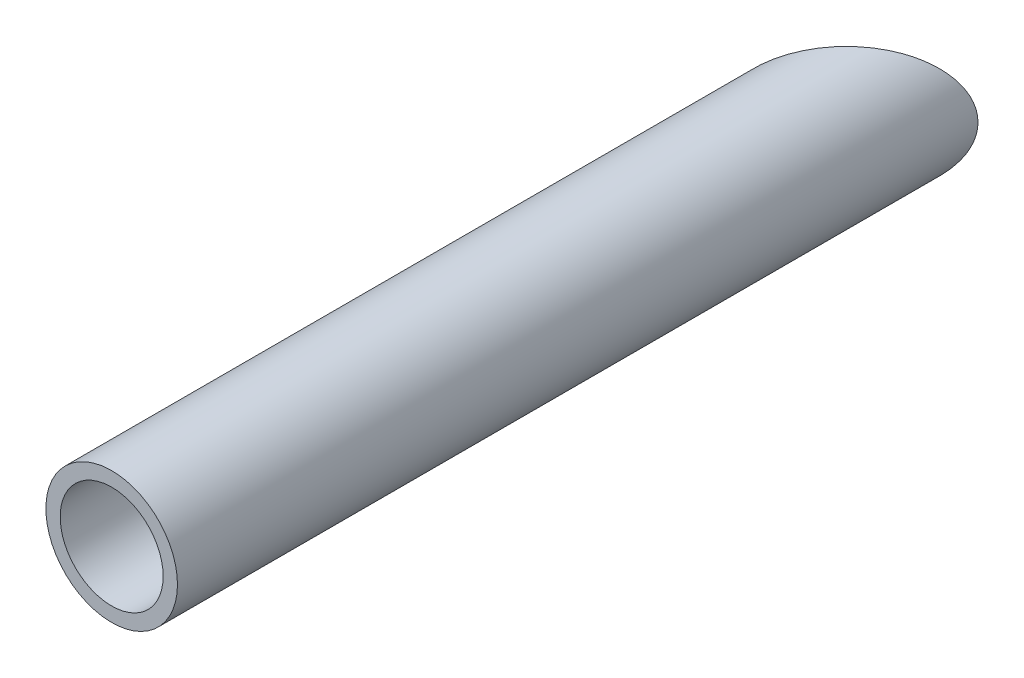
ISO-10303-21;
HEADER;
FILE_DESCRIPTION(('STEP AP214'),'2;1');
FILE_NAME('part.step','',(''),(''),'','','');
FILE_SCHEMA(('AUTOMOTIVE_DESIGN { 1 0 10303 214 1 1 1 1 }'));
ENDSEC;
DATA;
#1=APPLICATION_CONTEXT('core data for automotive mechanical design processes');
#2=APPLICATION_PROTOCOL_DEFINITION('international standard','automotive_design',2000,#1);
#3=PRODUCT_CONTEXT('',#1,'mechanical');
#4=PRODUCT('Part','Part','',(#3));
#5=PRODUCT_RELATED_PRODUCT_CATEGORY('part','',(#4));
#6=PRODUCT_DEFINITION_FORMATION('','',#4);
#7=PRODUCT_DEFINITION_CONTEXT('part definition',#1,'design');
#8=PRODUCT_DEFINITION('design','',#6,#7);
#9=PRODUCT_DEFINITION_SHAPE('','',#8);
#10=(LENGTH_UNIT() NAMED_UNIT(*) SI_UNIT(.MILLI.,.METRE.));
#11=(NAMED_UNIT(*) PLANE_ANGLE_UNIT() SI_UNIT($,.RADIAN.));
#12=(NAMED_UNIT(*) SI_UNIT($,.STERADIAN.) SOLID_ANGLE_UNIT());
#13=UNCERTAINTY_MEASURE_WITH_UNIT(LENGTH_MEASURE(1.E-05),#10,'distance_accuracy_value','');
#14=(GEOMETRIC_REPRESENTATION_CONTEXT(3) GLOBAL_UNCERTAINTY_ASSIGNED_CONTEXT((#13)) GLOBAL_UNIT_ASSIGNED_CONTEXT((#10,
#11,#12)) REPRESENTATION_CONTEXT('',''));
#15=CARTESIAN_POINT('',(0.,0.,0.));
#16=DIRECTION('',(0.,0.,1.));
#17=DIRECTION('',(1.,0.,0.));
#18=AXIS2_PLACEMENT_3D('',#15,#16,#17);
#19=CARTESIAN_POINT('',(0.,0.,0.));
#20=DIRECTION('',(0.,0.,1.));
#21=DIRECTION('',(1.,0.,0.));
#22=AXIS2_PLACEMENT_3D('',#19,#20,#21);
#23=CYLINDRICAL_SURFACE('',#22,13.0683);
#24=CARTESIAN_POINT('',(0.,0.,203.2));
#25=DIRECTION('',(0.,0.,1.));
#26=DIRECTION('',(1.,0.,0.));
#27=AXIS2_PLACEMENT_3D('',#24,#25,#26);
#28=CIRCLE('',#27,13.0683);
#29=CARTESIAN_POINT('',(13.0683,0.,203.2));
#30=VERTEX_POINT('',#29);
#31=EDGE_CURVE('E17',#30,#30,#28,.F.);
#32=ORIENTED_EDGE('',*,*,#31,.F.);
#33=EDGE_LOOP('',(#32));
#34=FACE_BOUND('',#33,.T.);
#35=CARTESIAN_POINT('',(0.,0.,16.7005));
#36=DIRECTION('',(0.707106781186548,0.,0.707106781186548));
#37=DIRECTION('',(-0.707106781186548,0.,0.707106781186548));
#38=AXIS2_PLACEMENT_3D('',#35,#36,#37);
#39=ELLIPSE('',#38,18.4813670971603,13.0683);
#40=CARTESIAN_POINT('',(-13.0683,0.,29.7688));
#41=VERTEX_POINT('',#40);
#42=EDGE_CURVE('E26',#41,#41,#39,.F.);
#43=ORIENTED_EDGE('',*,*,#42,.T.);
#44=EDGE_LOOP('',(#43));
#45=FACE_BOUND('',#44,.T.);
#46=ADVANCED_FACE('F14',(#34,#45),#23,.F.);
#47=CARTESIAN_POINT('',(0.,0.,203.2));
#48=DIRECTION('',(0.,0.,1.));
#49=DIRECTION('',(1.,0.,0.));
#50=AXIS2_PLACEMENT_3D('',#47,#48,#49);
#51=PLANE('',#50);
#52=ORIENTED_EDGE('',*,*,#31,.T.);
#53=EDGE_LOOP('',(#52));
#54=FACE_BOUND('',#53,.T.);
#55=CARTESIAN_POINT('',(0.,0.,203.2));
#56=DIRECTION('',(0.,0.,1.));
#57=DIRECTION('',(1.,0.,0.));
#58=AXIS2_PLACEMENT_3D('',#55,#56,#57);
#59=CIRCLE('',#58,16.7005);
#60=CARTESIAN_POINT('',(16.7005,0.,203.2));
#61=VERTEX_POINT('',#60);
#62=EDGE_CURVE('E21',#61,#61,#59,.F.);
#63=ORIENTED_EDGE('',*,*,#62,.F.);
#64=EDGE_LOOP('',(#63));
#65=FACE_BOUND('',#64,.T.);
#66=ADVANCED_FACE('F34',(#54,#65),#51,.T.);
#67=CARTESIAN_POINT('',(-16.7005,-26.2763,33.401));
#68=DIRECTION('',(0.707106781186548,0.,0.707106781186548));
#69=DIRECTION('',(0.707106781186548,0.,-0.707106781186548));
#70=AXIS2_PLACEMENT_3D('',#67,#68,#69);
#71=PLANE('',#70);
#72=ORIENTED_EDGE('',*,*,#42,.F.);
#73=EDGE_LOOP('',(#72));
#74=FACE_BOUND('',#73,.T.);
#75=CARTESIAN_POINT('',(0.,0.,16.7005));
#76=DIRECTION('',(0.707106781186548,0.,0.707106781186548));
#77=DIRECTION('',(-0.707106781186548,0.,0.707106781186548));
#78=AXIS2_PLACEMENT_3D('',#75,#76,#77);
#79=ELLIPSE('',#78,23.6180735984119,16.7005);
#80=CARTESIAN_POINT('',(-16.7005,0.,33.401));
#81=VERTEX_POINT('',#80);
#82=EDGE_CURVE('E10',#81,#81,#79,.T.);
#83=ORIENTED_EDGE('',*,*,#82,.F.);
#84=EDGE_LOOP('',(#83));
#85=FACE_BOUND('',#84,.T.);
#86=ADVANCED_FACE('F42',(#74,#85),#71,.F.);
#87=CARTESIAN_POINT('',(0.,0.,0.));
#88=DIRECTION('',(0.,0.,1.));
#89=DIRECTION('',(1.,0.,0.));
#90=AXIS2_PLACEMENT_3D('',#87,#88,#89);
#91=CYLINDRICAL_SURFACE('',#90,16.7005);
#92=ORIENTED_EDGE('',*,*,#62,.T.);
#93=EDGE_LOOP('',(#92));
#94=FACE_BOUND('',#93,.T.);
#95=ORIENTED_EDGE('',*,*,#82,.T.);
#96=EDGE_LOOP('',(#95));
#97=FACE_BOUND('',#96,.T.);
#98=ADVANCED_FACE('F43',(#94,#97),#91,.T.);
#99=CLOSED_SHELL('',(#46,#66,#86,#98));
#100=MANIFOLD_SOLID_BREP('B1',#99);
#101=ADVANCED_BREP_SHAPE_REPRESENTATION('',(#18,#100),#14);
#102=SHAPE_DEFINITION_REPRESENTATION(#9,#101);
ENDSEC;
END-ISO-10303-21;
